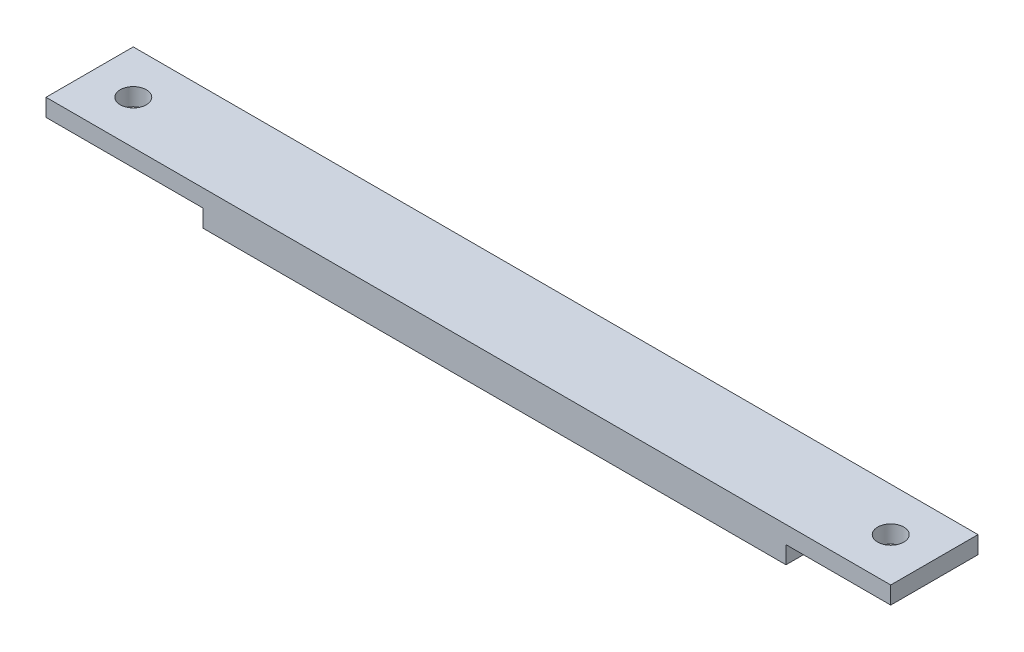
ISO-10303-21;
HEADER;
FILE_DESCRIPTION(('STEP AP214'),'2;1');
FILE_NAME('part.step','',(''),(''),'','','');
FILE_SCHEMA(('AUTOMOTIVE_DESIGN { 1 0 10303 214 1 1 1 1 }'));
ENDSEC;
DATA;
#1=APPLICATION_CONTEXT('core data for automotive mechanical design processes');
#2=APPLICATION_PROTOCOL_DEFINITION('international standard','automotive_design',2000,#1);
#3=PRODUCT_CONTEXT('',#1,'mechanical');
#4=PRODUCT('Part','Part','',(#3));
#5=PRODUCT_RELATED_PRODUCT_CATEGORY('part','',(#4));
#6=PRODUCT_DEFINITION_FORMATION('','',#4);
#7=PRODUCT_DEFINITION_CONTEXT('part definition',#1,'design');
#8=PRODUCT_DEFINITION('design','',#6,#7);
#9=PRODUCT_DEFINITION_SHAPE('','',#8);
#10=(LENGTH_UNIT() NAMED_UNIT(*) SI_UNIT(.MILLI.,.METRE.));
#11=(NAMED_UNIT(*) PLANE_ANGLE_UNIT() SI_UNIT($,.RADIAN.));
#12=(NAMED_UNIT(*) SI_UNIT($,.STERADIAN.) SOLID_ANGLE_UNIT());
#13=UNCERTAINTY_MEASURE_WITH_UNIT(LENGTH_MEASURE(1.E-05),#10,'distance_accuracy_value','');
#14=(GEOMETRIC_REPRESENTATION_CONTEXT(3) GLOBAL_UNCERTAINTY_ASSIGNED_CONTEXT((#13)) GLOBAL_UNIT_ASSIGNED_CONTEXT((#10,
#11,#12)) REPRESENTATION_CONTEXT('',''));
#15=CARTESIAN_POINT('',(0.,0.,0.));
#16=DIRECTION('',(0.,0.,1.));
#17=DIRECTION('',(1.,0.,0.));
#18=AXIS2_PLACEMENT_3D('',#15,#16,#17);
#19=CARTESIAN_POINT('',(-48.4000000000001,-0.999999999999999,10.));
#20=DIRECTION('',(0.,1.,0.));
#21=DIRECTION('',(0.,0.,1.));
#22=AXIS2_PLACEMENT_3D('',#19,#20,#21);
#23=PLANE('',#22);
#24=CARTESIAN_POINT('',(43.3999999999999,-0.999999999999999,5.));
#25=DIRECTION('',(0.,-1.,0.));
#26=DIRECTION('',(0.,0.,-1.));
#27=AXIS2_PLACEMENT_3D('',#24,#25,#26);
#28=CIRCLE('',#27,1.5);
#29=CARTESIAN_POINT('',(43.3999999999999,-0.999999999999999,3.5));
#30=VERTEX_POINT('',#29);
#31=EDGE_CURVE('E211',#30,#30,#28,.T.);
#32=ORIENTED_EDGE('',*,*,#31,.F.);
#33=EDGE_LOOP('',(#32));
#34=FACE_BOUND('',#33,.T.);
#35=DIRECTION('',(0.,0.,1.));
#36=VECTOR('',#35,1.);
#37=CARTESIAN_POINT('',(36.3999999999999,-0.999999999999999,0.));
#38=LINE('',#37,#36);
#39=CARTESIAN_POINT('',(36.3999999999999,-0.999999999999999,0.));
#40=VERTEX_POINT('',#39);
#41=CARTESIAN_POINT('',(36.3999999999999,-0.999999999999999,10.));
#42=VERTEX_POINT('',#41);
#43=EDGE_CURVE('E130',#40,#42,#38,.T.);
#44=ORIENTED_EDGE('',*,*,#43,.F.);
#45=DIRECTION('',(1.,0.,0.));
#46=VECTOR('',#45,1.);
#47=CARTESIAN_POINT('',(-48.4000000000001,-0.999999999999999,0.));
#48=LINE('',#47,#46);
#49=CARTESIAN_POINT('',(48.3999999999999,-0.999999999999999,0.));
#50=VERTEX_POINT('',#49);
#51=EDGE_CURVE('E162',#40,#50,#48,.T.);
#52=ORIENTED_EDGE('',*,*,#51,.T.);
#53=DIRECTION('',(0.,0.,-1.));
#54=VECTOR('',#53,1.);
#55=CARTESIAN_POINT('',(48.3999999999999,-0.999999999999999,10.));
#56=LINE('',#55,#54);
#57=CARTESIAN_POINT('',(48.3999999999999,-0.999999999999999,10.));
#58=VERTEX_POINT('',#57);
#59=EDGE_CURVE('E155',#58,#50,#56,.T.);
#60=ORIENTED_EDGE('',*,*,#59,.F.);
#61=DIRECTION('',(1.,0.,0.));
#62=VECTOR('',#61,1.);
#63=CARTESIAN_POINT('',(-48.4000000000001,-0.999999999999999,10.));
#64=LINE('',#63,#62);
#65=EDGE_CURVE('E55',#42,#58,#64,.T.);
#66=ORIENTED_EDGE('',*,*,#65,.F.);
#67=EDGE_LOOP('',(#44,#52,#60,#66));
#68=FACE_BOUND('',#67,.T.);
#69=ADVANCED_FACE('F39',(#34,#68),#23,.F.);
#70=CARTESIAN_POINT('',(-43.3999999999999,-0.999999999999999,5.));
#71=DIRECTION('',(0.,-1.,0.));
#72=DIRECTION('',(0.,0.,1.));
#73=AXIS2_PLACEMENT_3D('',#70,#71,#72);
#74=CIRCLE('',#73,1.5);
#75=CARTESIAN_POINT('',(-43.3999999999999,-0.999999999999999,6.5));
#76=VERTEX_POINT('',#75);
#77=EDGE_CURVE('E203',#76,#76,#74,.T.);
#78=ORIENTED_EDGE('',*,*,#77,.F.);
#79=EDGE_LOOP('',(#78));
#80=FACE_BOUND('',#79,.T.);
#81=DIRECTION('',(0.,0.,-1.));
#82=VECTOR('',#81,1.);
#83=CARTESIAN_POINT('',(-30.4000000000001,-0.999999999999999,0.));
#84=LINE('',#83,#82);
#85=CARTESIAN_POINT('',(-30.4000000000001,-0.999999999999999,10.));
#86=VERTEX_POINT('',#85);
#87=CARTESIAN_POINT('',(-30.4000000000001,-0.999999999999999,0.));
#88=VERTEX_POINT('',#87);
#89=EDGE_CURVE('E63',#86,#88,#84,.T.);
#90=ORIENTED_EDGE('',*,*,#89,.F.);
#91=CARTESIAN_POINT('',(-48.4000000000001,-0.999999999999999,10.));
#92=VERTEX_POINT('',#91);
#93=EDGE_CURVE('E153',#92,#86,#64,.T.);
#94=ORIENTED_EDGE('',*,*,#93,.F.);
#95=DIRECTION('',(0.,0.,-1.));
#96=VECTOR('',#95,1.);
#97=CARTESIAN_POINT('',(-48.4000000000001,-0.999999999999999,10.));
#98=LINE('',#97,#96);
#99=CARTESIAN_POINT('',(-48.4000000000001,-0.999999999999999,0.));
#100=VERTEX_POINT('',#99);
#101=EDGE_CURVE('E168',#92,#100,#98,.T.);
#102=ORIENTED_EDGE('',*,*,#101,.T.);
#103=EDGE_CURVE('E147',#100,#88,#48,.T.);
#104=ORIENTED_EDGE('',*,*,#103,.T.);
#105=EDGE_LOOP('',(#90,#94,#102,#104));
#106=FACE_BOUND('',#105,.T.);
#107=ADVANCED_FACE('F186',(#80,#106),#23,.F.);
#108=CARTESIAN_POINT('',(48.3999999999999,1.,10.));
#109=DIRECTION('',(-1.,0.,0.));
#110=DIRECTION('',(0.,0.,1.));
#111=AXIS2_PLACEMENT_3D('',#108,#109,#110);
#112=PLANE('',#111);
#113=DIRECTION('',(0.,1.,0.));
#114=VECTOR('',#113,1.);
#115=CARTESIAN_POINT('',(48.3999999999999,1.,0.));
#116=LINE('',#115,#114);
#117=CARTESIAN_POINT('',(48.3999999999999,1.,0.));
#118=VERTEX_POINT('',#117);
#119=EDGE_CURVE('E132',#50,#118,#116,.T.);
#120=ORIENTED_EDGE('',*,*,#119,.T.);
#121=DIRECTION('',(0.,0.,-1.));
#122=VECTOR('',#121,1.);
#123=CARTESIAN_POINT('',(48.3999999999999,1.,10.));
#124=LINE('',#123,#122);
#125=CARTESIAN_POINT('',(48.3999999999999,1.,10.));
#126=VERTEX_POINT('',#125);
#127=EDGE_CURVE('E11',#126,#118,#124,.T.);
#128=ORIENTED_EDGE('',*,*,#127,.F.);
#129=DIRECTION('',(0.,1.,0.));
#130=VECTOR('',#129,1.);
#131=CARTESIAN_POINT('',(48.3999999999999,1.,10.));
#132=LINE('',#131,#130);
#133=EDGE_CURVE('E143',#58,#126,#132,.T.);
#134=ORIENTED_EDGE('',*,*,#133,.F.);
#135=ORIENTED_EDGE('',*,*,#59,.T.);
#136=EDGE_LOOP('',(#120,#128,#134,#135));
#137=FACE_BOUND('',#136,.T.);
#138=ADVANCED_FACE('F41',(#137),#112,.F.);
#139=CARTESIAN_POINT('',(-48.4000000000001,1.,10.));
#140=DIRECTION('',(0.,-1.,0.));
#141=DIRECTION('',(0.,0.,-1.));
#142=AXIS2_PLACEMENT_3D('',#139,#140,#141);
#143=PLANE('',#142);
#144=CARTESIAN_POINT('',(43.3999999999999,1.,5.));
#145=DIRECTION('',(0.,-1.,0.));
#146=DIRECTION('',(0.,0.,-1.));
#147=AXIS2_PLACEMENT_3D('',#144,#145,#146);
#148=CIRCLE('',#147,1.5);
#149=CARTESIAN_POINT('',(43.3999999999999,1.,3.5));
#150=VERTEX_POINT('',#149);
#151=EDGE_CURVE('E192',#150,#150,#148,.T.);
#152=ORIENTED_EDGE('',*,*,#151,.T.);
#153=EDGE_LOOP('',(#152));
#154=FACE_BOUND('',#153,.T.);
#155=CARTESIAN_POINT('',(-43.3999999999999,1.,5.));
#156=DIRECTION('',(0.,-1.,0.));
#157=DIRECTION('',(0.,0.,1.));
#158=AXIS2_PLACEMENT_3D('',#155,#156,#157);
#159=CIRCLE('',#158,1.5);
#160=CARTESIAN_POINT('',(-43.3999999999999,1.,6.5));
#161=VERTEX_POINT('',#160);
#162=EDGE_CURVE('E207',#161,#161,#159,.T.);
#163=ORIENTED_EDGE('',*,*,#162,.T.);
#164=EDGE_LOOP('',(#163));
#165=FACE_BOUND('',#164,.T.);
#166=DIRECTION('',(-1.,0.,0.));
#167=VECTOR('',#166,1.);
#168=CARTESIAN_POINT('',(-48.4000000000001,1.,0.));
#169=LINE('',#168,#167);
#170=CARTESIAN_POINT('',(-48.4000000000001,1.,0.));
#171=VERTEX_POINT('',#170);
#172=EDGE_CURVE('E137',#118,#171,#169,.T.);
#173=ORIENTED_EDGE('',*,*,#172,.T.);
#174=DIRECTION('',(0.,0.,-1.));
#175=VECTOR('',#174,1.);
#176=CARTESIAN_POINT('',(-48.4000000000001,1.,10.));
#177=LINE('',#176,#175);
#178=CARTESIAN_POINT('',(-48.4000000000001,1.,10.));
#179=VERTEX_POINT('',#178);
#180=EDGE_CURVE('E48',#179,#171,#177,.T.);
#181=ORIENTED_EDGE('',*,*,#180,.F.);
#182=DIRECTION('',(-1.,0.,0.));
#183=VECTOR('',#182,1.);
#184=CARTESIAN_POINT('',(-48.4000000000001,1.,10.));
#185=LINE('',#184,#183);
#186=EDGE_CURVE('E146',#126,#179,#185,.T.);
#187=ORIENTED_EDGE('',*,*,#186,.F.);
#188=ORIENTED_EDGE('',*,*,#127,.T.);
#189=EDGE_LOOP('',(#173,#181,#187,#188));
#190=FACE_BOUND('',#189,.T.);
#191=ADVANCED_FACE('F219',(#154,#165,#190),#143,.F.);
#192=CARTESIAN_POINT('',(-48.4000000000001,1.,10.));
#193=DIRECTION('',(1.,0.,0.));
#194=DIRECTION('',(0.,0.,-1.));
#195=AXIS2_PLACEMENT_3D('',#192,#193,#194);
#196=PLANE('',#195);
#197=DIRECTION('',(0.,-1.,0.));
#198=VECTOR('',#197,1.);
#199=CARTESIAN_POINT('',(-48.4000000000001,1.,0.));
#200=LINE('',#199,#198);
#201=EDGE_CURVE('E159',#171,#100,#200,.T.);
#202=ORIENTED_EDGE('',*,*,#201,.T.);
#203=ORIENTED_EDGE('',*,*,#101,.F.);
#204=DIRECTION('',(0.,-1.,0.));
#205=VECTOR('',#204,1.);
#206=CARTESIAN_POINT('',(-48.4000000000001,1.,10.));
#207=LINE('',#206,#205);
#208=EDGE_CURVE('E150',#179,#92,#207,.T.);
#209=ORIENTED_EDGE('',*,*,#208,.F.);
#210=ORIENTED_EDGE('',*,*,#180,.T.);
#211=EDGE_LOOP('',(#202,#203,#209,#210));
#212=FACE_BOUND('',#211,.T.);
#213=ADVANCED_FACE('F177',(#212),#196,.F.);
#214=CARTESIAN_POINT('',(0.,0.,10.));
#215=DIRECTION('',(0.,0.,1.));
#216=DIRECTION('',(1.,0.,0.));
#217=AXIS2_PLACEMENT_3D('',#214,#215,#216);
#218=PLANE('',#217);
#219=ORIENTED_EDGE('',*,*,#133,.T.);
#220=ORIENTED_EDGE('',*,*,#186,.T.);
#221=ORIENTED_EDGE('',*,*,#208,.T.);
#222=ORIENTED_EDGE('',*,*,#93,.T.);
#223=DIRECTION('',(0.,1.,0.));
#224=VECTOR('',#223,1.);
#225=CARTESIAN_POINT('',(-30.4000000000001,-3.,10.));
#226=LINE('',#225,#224);
#227=CARTESIAN_POINT('',(-30.4000000000001,-3.,10.));
#228=VERTEX_POINT('',#227);
#229=EDGE_CURVE('E113',#228,#86,#226,.T.);
#230=ORIENTED_EDGE('',*,*,#229,.F.);
#231=DIRECTION('',(-1.,0.,0.));
#232=VECTOR('',#231,1.);
#233=CARTESIAN_POINT('',(-30.4000000000001,-3.,10.));
#234=LINE('',#233,#232);
#235=CARTESIAN_POINT('',(36.3999999999999,-3.,10.));
#236=VERTEX_POINT('',#235);
#237=EDGE_CURVE('E105',#236,#228,#234,.T.);
#238=ORIENTED_EDGE('',*,*,#237,.F.);
#239=DIRECTION('',(0.,1.,0.));
#240=VECTOR('',#239,1.);
#241=CARTESIAN_POINT('',(36.3999999999999,-3.,10.));
#242=LINE('',#241,#240);
#243=EDGE_CURVE('E110',#236,#42,#242,.T.);
#244=ORIENTED_EDGE('',*,*,#243,.T.);
#245=ORIENTED_EDGE('',*,*,#65,.T.);
#246=EDGE_LOOP('',(#219,#220,#221,#222,#230,#238,#244,#245));
#247=FACE_BOUND('',#246,.T.);
#248=ADVANCED_FACE('F108',(#247),#218,.T.);
#249=CARTESIAN_POINT('',(0.,0.,0.));
#250=DIRECTION('',(0.,0.,1.));
#251=DIRECTION('',(1.,0.,0.));
#252=AXIS2_PLACEMENT_3D('',#249,#250,#251);
#253=PLANE('',#252);
#254=ORIENTED_EDGE('',*,*,#119,.F.);
#255=ORIENTED_EDGE('',*,*,#51,.F.);
#256=DIRECTION('',(0.,1.,0.));
#257=VECTOR('',#256,1.);
#258=CARTESIAN_POINT('',(36.3999999999999,-3.,0.));
#259=LINE('',#258,#257);
#260=CARTESIAN_POINT('',(36.3999999999999,-3.,0.));
#261=VERTEX_POINT('',#260);
#262=EDGE_CURVE('E196',#261,#40,#259,.T.);
#263=ORIENTED_EDGE('',*,*,#262,.F.);
#264=DIRECTION('',(1.,0.,0.));
#265=VECTOR('',#264,1.);
#266=CARTESIAN_POINT('',(-30.4000000000001,-3.,0.));
#267=LINE('',#266,#265);
#268=CARTESIAN_POINT('',(-30.4000000000001,-3.,0.));
#269=VERTEX_POINT('',#268);
#270=EDGE_CURVE('E123',#269,#261,#267,.T.);
#271=ORIENTED_EDGE('',*,*,#270,.F.);
#272=DIRECTION('',(0.,1.,0.));
#273=VECTOR('',#272,1.);
#274=CARTESIAN_POINT('',(-30.4000000000001,-3.,0.));
#275=LINE('',#274,#273);
#276=EDGE_CURVE('E139',#269,#88,#275,.T.);
#277=ORIENTED_EDGE('',*,*,#276,.T.);
#278=ORIENTED_EDGE('',*,*,#103,.F.);
#279=ORIENTED_EDGE('',*,*,#201,.F.);
#280=ORIENTED_EDGE('',*,*,#172,.F.);
#281=EDGE_LOOP('',(#254,#255,#263,#271,#277,#278,#279,#280));
#282=FACE_BOUND('',#281,.T.);
#283=ADVANCED_FACE('F183',(#282),#253,.F.);
#284=CARTESIAN_POINT('',(36.3999999999999,-3.,0.));
#285=DIRECTION('',(-1.,0.,0.));
#286=DIRECTION('',(0.,0.,1.));
#287=AXIS2_PLACEMENT_3D('',#284,#285,#286);
#288=PLANE('',#287);
#289=ORIENTED_EDGE('',*,*,#43,.T.);
#290=ORIENTED_EDGE('',*,*,#243,.F.);
#291=DIRECTION('',(0.,0.,1.));
#292=VECTOR('',#291,1.);
#293=CARTESIAN_POINT('',(36.3999999999999,-3.,0.));
#294=LINE('',#293,#292);
#295=EDGE_CURVE('E118',#261,#236,#294,.T.);
#296=ORIENTED_EDGE('',*,*,#295,.F.);
#297=ORIENTED_EDGE('',*,*,#262,.T.);
#298=EDGE_LOOP('',(#289,#290,#296,#297));
#299=FACE_BOUND('',#298,.T.);
#300=ADVANCED_FACE('F129',(#299),#288,.F.);
#301=CARTESIAN_POINT('',(-30.4000000000001,-3.,0.));
#302=DIRECTION('',(1.,0.,0.));
#303=DIRECTION('',(0.,0.,-1.));
#304=AXIS2_PLACEMENT_3D('',#301,#302,#303);
#305=PLANE('',#304);
#306=ORIENTED_EDGE('',*,*,#89,.T.);
#307=ORIENTED_EDGE('',*,*,#276,.F.);
#308=DIRECTION('',(0.,0.,-1.));
#309=VECTOR('',#308,1.);
#310=CARTESIAN_POINT('',(-30.4000000000001,-3.,0.));
#311=LINE('',#310,#309);
#312=EDGE_CURVE('E117',#228,#269,#311,.T.);
#313=ORIENTED_EDGE('',*,*,#312,.F.);
#314=ORIENTED_EDGE('',*,*,#229,.T.);
#315=EDGE_LOOP('',(#306,#307,#313,#314));
#316=FACE_BOUND('',#315,.T.);
#317=ADVANCED_FACE('F188',(#316),#305,.F.);
#318=CARTESIAN_POINT('',(0.,-3.,0.));
#319=DIRECTION('',(0.,1.,0.));
#320=DIRECTION('',(0.,0.,1.));
#321=AXIS2_PLACEMENT_3D('',#318,#319,#320);
#322=PLANE('',#321);
#323=ORIENTED_EDGE('',*,*,#295,.T.);
#324=ORIENTED_EDGE('',*,*,#237,.T.);
#325=ORIENTED_EDGE('',*,*,#312,.T.);
#326=ORIENTED_EDGE('',*,*,#270,.T.);
#327=EDGE_LOOP('',(#323,#324,#325,#326));
#328=FACE_BOUND('',#327,.T.);
#329=ADVANCED_FACE('F121',(#328),#322,.F.);
#330=CARTESIAN_POINT('',(-43.3999999999999,1.,5.));
#331=DIRECTION('',(0.,-1.,0.));
#332=DIRECTION('',(0.,0.,-1.));
#333=AXIS2_PLACEMENT_3D('',#330,#331,#332);
#334=CYLINDRICAL_SURFACE('',#333,1.5);
#335=ORIENTED_EDGE('',*,*,#162,.F.);
#336=EDGE_LOOP('',(#335));
#337=FACE_BOUND('',#336,.T.);
#338=ORIENTED_EDGE('',*,*,#77,.T.);
#339=EDGE_LOOP('',(#338));
#340=FACE_BOUND('',#339,.T.);
#341=ADVANCED_FACE('F225',(#337,#340),#334,.F.);
#342=CARTESIAN_POINT('',(43.3999999999999,1.,5.));
#343=DIRECTION('',(0.,-1.,0.));
#344=DIRECTION('',(0.,0.,-1.));
#345=AXIS2_PLACEMENT_3D('',#342,#343,#344);
#346=CYLINDRICAL_SURFACE('',#345,1.5);
#347=ORIENTED_EDGE('',*,*,#151,.F.);
#348=EDGE_LOOP('',(#347));
#349=FACE_BOUND('',#348,.T.);
#350=ORIENTED_EDGE('',*,*,#31,.T.);
#351=EDGE_LOOP('',(#350));
#352=FACE_BOUND('',#351,.T.);
#353=ADVANCED_FACE('F222',(#349,#352),#346,.F.);
#354=CLOSED_SHELL('',(#69,#107,#138,#191,#213,#248,#283,#300,#317,#329,#341,#353));
#355=MANIFOLD_SOLID_BREP('B2',#354);
#356=ADVANCED_BREP_SHAPE_REPRESENTATION('',(#18,#355),#14);
#357=SHAPE_DEFINITION_REPRESENTATION(#9,#356);
ENDSEC;
END-ISO-10303-21;
